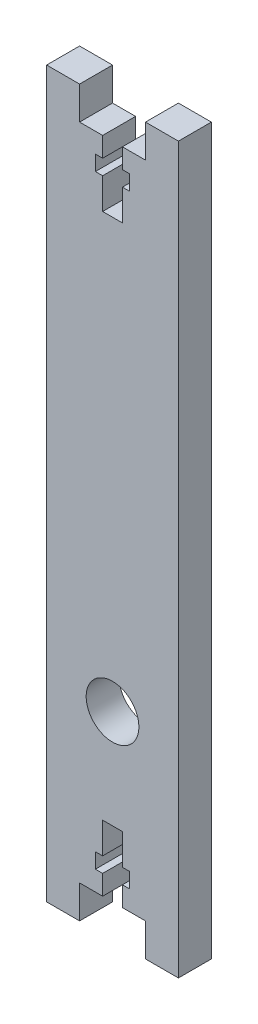
ISO-10303-21;
HEADER;
FILE_DESCRIPTION(('STEP AP214'),'2;1');
FILE_NAME('part.step','',(''),(''),'','','');
FILE_SCHEMA(('AUTOMOTIVE_DESIGN { 1 0 10303 214 1 1 1 1 }'));
ENDSEC;
DATA;
#1=APPLICATION_CONTEXT('core data for automotive mechanical design processes');
#2=APPLICATION_PROTOCOL_DEFINITION('international standard','automotive_design',2000,#1);
#3=PRODUCT_CONTEXT('',#1,'mechanical');
#4=PRODUCT('Part','Part','',(#3));
#5=PRODUCT_RELATED_PRODUCT_CATEGORY('part','',(#4));
#6=PRODUCT_DEFINITION_FORMATION('','',#4);
#7=PRODUCT_DEFINITION_CONTEXT('part definition',#1,'design');
#8=PRODUCT_DEFINITION('design','',#6,#7);
#9=PRODUCT_DEFINITION_SHAPE('','',#8);
#10=(LENGTH_UNIT() NAMED_UNIT(*) SI_UNIT(.MILLI.,.METRE.));
#11=(NAMED_UNIT(*) PLANE_ANGLE_UNIT() SI_UNIT($,.RADIAN.));
#12=(NAMED_UNIT(*) SI_UNIT($,.STERADIAN.) SOLID_ANGLE_UNIT());
#13=UNCERTAINTY_MEASURE_WITH_UNIT(LENGTH_MEASURE(1.E-05),#10,'distance_accuracy_value','');
#14=(GEOMETRIC_REPRESENTATION_CONTEXT(3) GLOBAL_UNCERTAINTY_ASSIGNED_CONTEXT((#13)) GLOBAL_UNIT_ASSIGNED_CONTEXT((#10,
#11,#12)) REPRESENTATION_CONTEXT('',''));
#15=CARTESIAN_POINT('',(0.,0.,0.));
#16=DIRECTION('',(0.,0.,1.));
#17=DIRECTION('',(1.,0.,0.));
#18=AXIS2_PLACEMENT_3D('',#15,#16,#17);
#19=CARTESIAN_POINT('',(0.,0.,5.));
#20=DIRECTION('',(0.,0.,-1.));
#21=DIRECTION('',(-1.,0.,0.));
#22=AXIS2_PLACEMENT_3D('',#19,#20,#21);
#23=PLANE('',#22);
#24=DIRECTION('',(0.,-1.,0.));
#25=VECTOR('',#24,1.);
#26=CARTESIAN_POINT('',(-10.,85.,5.));
#27=LINE('',#26,#25);
#28=CARTESIAN_POINT('',(-10.,85.,5.));
#29=VERTEX_POINT('',#28);
#30=CARTESIAN_POINT('',(-9.99999999999999,-25.,5.));
#31=VERTEX_POINT('',#30);
#32=EDGE_CURVE('E176',#29,#31,#27,.T.);
#33=ORIENTED_EDGE('',*,*,#32,.T.);
#34=DIRECTION('',(1.,0.,0.));
#35=VECTOR('',#34,1.);
#36=CARTESIAN_POINT('',(-4.99999999999999,-25.,5.));
#37=LINE('',#36,#35);
#38=CARTESIAN_POINT('',(-4.99999999999999,-25.,5.));
#39=VERTEX_POINT('',#38);
#40=EDGE_CURVE('E558',#31,#39,#37,.T.);
#41=ORIENTED_EDGE('',*,*,#40,.T.);
#42=DIRECTION('',(0.,1.,0.));
#43=VECTOR('',#42,1.);
#44=CARTESIAN_POINT('',(-4.99999999999999,-25.,5.));
#45=LINE('',#44,#43);
#46=CARTESIAN_POINT('',(-5.,-20.,5.));
#47=VERTEX_POINT('',#46);
#48=EDGE_CURVE('E469',#39,#47,#45,.T.);
#49=ORIENTED_EDGE('',*,*,#48,.T.);
#50=DIRECTION('',(1.,0.,0.));
#51=VECTOR('',#50,1.);
#52=CARTESIAN_POINT('',(-1.49999999999999,-20.,5.));
#53=LINE('',#52,#51);
#54=CARTESIAN_POINT('',(-1.49999999999999,-20.,5.));
#55=VERTEX_POINT('',#54);
#56=EDGE_CURVE('E488',#47,#55,#53,.T.);
#57=ORIENTED_EDGE('',*,*,#56,.T.);
#58=DIRECTION('',(0.,1.,0.));
#59=VECTOR('',#58,1.);
#60=CARTESIAN_POINT('',(-1.49999999999999,-17.,5.));
#61=LINE('',#60,#59);
#62=CARTESIAN_POINT('',(-1.49999999999999,-17.,5.));
#63=VERTEX_POINT('',#62);
#64=EDGE_CURVE('E485',#55,#63,#61,.T.);
#65=ORIENTED_EDGE('',*,*,#64,.T.);
#66=DIRECTION('',(-1.,0.,0.));
#67=VECTOR('',#66,1.);
#68=CARTESIAN_POINT('',(-1.49999999999999,-17.,5.));
#69=LINE('',#68,#67);
#70=CARTESIAN_POINT('',(-2.59999999999999,-17.,5.));
#71=VERTEX_POINT('',#70);
#72=EDGE_CURVE('E487',#63,#71,#69,.T.);
#73=ORIENTED_EDGE('',*,*,#72,.T.);
#74=DIRECTION('',(0.,1.,0.));
#75=VECTOR('',#74,1.);
#76=CARTESIAN_POINT('',(-2.59999999999999,-17.,5.));
#77=LINE('',#76,#75);
#78=CARTESIAN_POINT('',(-2.6,-14.7,5.));
#79=VERTEX_POINT('',#78);
#80=EDGE_CURVE('E490',#71,#79,#77,.T.);
#81=ORIENTED_EDGE('',*,*,#80,.T.);
#82=DIRECTION('',(1.,0.,0.));
#83=VECTOR('',#82,1.);
#84=CARTESIAN_POINT('',(-2.6,-14.7,5.));
#85=LINE('',#84,#83);
#86=CARTESIAN_POINT('',(-1.49999999999999,-14.7,5.));
#87=VERTEX_POINT('',#86);
#88=EDGE_CURVE('E496',#79,#87,#85,.T.);
#89=ORIENTED_EDGE('',*,*,#88,.T.);
#90=DIRECTION('',(0.,1.,0.));
#91=VECTOR('',#90,1.);
#92=CARTESIAN_POINT('',(-1.49999999999999,-10.,5.));
#93=LINE('',#92,#91);
#94=CARTESIAN_POINT('',(-1.49999999999999,-10.,5.));
#95=VERTEX_POINT('',#94);
#96=EDGE_CURVE('E498',#87,#95,#93,.T.);
#97=ORIENTED_EDGE('',*,*,#96,.T.);
#98=DIRECTION('',(1.,0.,0.));
#99=VECTOR('',#98,1.);
#100=CARTESIAN_POINT('',(1.50000000000001,-10.,5.));
#101=LINE('',#100,#99);
#102=CARTESIAN_POINT('',(1.50000000000001,-10.,5.));
#103=VERTEX_POINT('',#102);
#104=EDGE_CURVE('E500',#95,#103,#101,.T.);
#105=ORIENTED_EDGE('',*,*,#104,.T.);
#106=DIRECTION('',(0.,-1.,0.));
#107=VECTOR('',#106,1.);
#108=CARTESIAN_POINT('',(1.50000000000001,-14.7,5.));
#109=LINE('',#108,#107);
#110=CARTESIAN_POINT('',(1.50000000000001,-14.7,5.));
#111=VERTEX_POINT('',#110);
#112=EDGE_CURVE('E502',#103,#111,#109,.T.);
#113=ORIENTED_EDGE('',*,*,#112,.T.);
#114=DIRECTION('',(1.,0.,0.));
#115=VECTOR('',#114,1.);
#116=CARTESIAN_POINT('',(1.50000000000001,-14.7,5.));
#117=LINE('',#116,#115);
#118=CARTESIAN_POINT('',(2.60000000000001,-14.7,5.));
#119=VERTEX_POINT('',#118);
#120=EDGE_CURVE('E504',#111,#119,#117,.T.);
#121=ORIENTED_EDGE('',*,*,#120,.T.);
#122=DIRECTION('',(0.,-1.,0.));
#123=VECTOR('',#122,1.);
#124=CARTESIAN_POINT('',(2.60000000000001,-14.7,5.));
#125=LINE('',#124,#123);
#126=CARTESIAN_POINT('',(2.60000000000001,-17.,5.));
#127=VERTEX_POINT('',#126);
#128=EDGE_CURVE('E506',#119,#127,#125,.T.);
#129=ORIENTED_EDGE('',*,*,#128,.T.);
#130=DIRECTION('',(-1.,0.,0.));
#131=VECTOR('',#130,1.);
#132=CARTESIAN_POINT('',(2.60000000000001,-17.,5.));
#133=LINE('',#132,#131);
#134=CARTESIAN_POINT('',(1.50000000000001,-17.,5.));
#135=VERTEX_POINT('',#134);
#136=EDGE_CURVE('E508',#127,#135,#133,.T.);
#137=ORIENTED_EDGE('',*,*,#136,.T.);
#138=DIRECTION('',(0.,-1.,0.));
#139=VECTOR('',#138,1.);
#140=CARTESIAN_POINT('',(1.50000000000001,-20.,5.));
#141=LINE('',#140,#139);
#142=CARTESIAN_POINT('',(1.50000000000001,-20.,5.));
#143=VERTEX_POINT('',#142);
#144=EDGE_CURVE('E510',#135,#143,#141,.T.);
#145=ORIENTED_EDGE('',*,*,#144,.T.);
#146=DIRECTION('',(1.,0.,0.));
#147=VECTOR('',#146,1.);
#148=CARTESIAN_POINT('',(1.50000000000001,-20.,5.));
#149=LINE('',#148,#147);
#150=CARTESIAN_POINT('',(5.00000000000001,-20.,5.));
#151=VERTEX_POINT('',#150);
#152=EDGE_CURVE('E512',#143,#151,#149,.T.);
#153=ORIENTED_EDGE('',*,*,#152,.T.);
#154=DIRECTION('',(0.,-1.,0.));
#155=VECTOR('',#154,1.);
#156=CARTESIAN_POINT('',(5.00000000000001,-20.,5.));
#157=LINE('',#156,#155);
#158=CARTESIAN_POINT('',(5.,-25.,5.));
#159=VERTEX_POINT('',#158);
#160=EDGE_CURVE('E514',#151,#159,#157,.T.);
#161=ORIENTED_EDGE('',*,*,#160,.T.);
#162=DIRECTION('',(1.,0.,0.));
#163=VECTOR('',#162,1.);
#164=CARTESIAN_POINT('',(5.,-25.,5.));
#165=LINE('',#164,#163);
#166=CARTESIAN_POINT('',(10.,-25.,5.));
#167=VERTEX_POINT('',#166);
#168=EDGE_CURVE('E516',#159,#167,#165,.T.);
#169=ORIENTED_EDGE('',*,*,#168,.T.);
#170=DIRECTION('',(0.,1.,0.));
#171=VECTOR('',#170,1.);
#172=CARTESIAN_POINT('',(10.,-25.,5.));
#173=LINE('',#172,#171);
#174=CARTESIAN_POINT('',(10.,85.,5.));
#175=VERTEX_POINT('',#174);
#176=EDGE_CURVE('E518',#167,#175,#173,.T.);
#177=ORIENTED_EDGE('',*,*,#176,.T.);
#178=DIRECTION('',(-1.,0.,0.));
#179=VECTOR('',#178,1.);
#180=CARTESIAN_POINT('',(5.,85.,5.));
#181=LINE('',#180,#179);
#182=CARTESIAN_POINT('',(5.,85.,5.));
#183=VERTEX_POINT('',#182);
#184=EDGE_CURVE('E520',#175,#183,#181,.T.);
#185=ORIENTED_EDGE('',*,*,#184,.T.);
#186=DIRECTION('',(0.,-1.,0.));
#187=VECTOR('',#186,1.);
#188=CARTESIAN_POINT('',(5.,80.,5.));
#189=LINE('',#188,#187);
#190=CARTESIAN_POINT('',(5.,80.,5.));
#191=VERTEX_POINT('',#190);
#192=EDGE_CURVE('E522',#183,#191,#189,.T.);
#193=ORIENTED_EDGE('',*,*,#192,.T.);
#194=DIRECTION('',(-1.,0.,0.));
#195=VECTOR('',#194,1.);
#196=CARTESIAN_POINT('',(1.5,80.,5.));
#197=LINE('',#196,#195);
#198=CARTESIAN_POINT('',(1.5,80.,5.));
#199=VERTEX_POINT('',#198);
#200=EDGE_CURVE('E524',#191,#199,#197,.T.);
#201=ORIENTED_EDGE('',*,*,#200,.T.);
#202=DIRECTION('',(0.,-1.,0.));
#203=VECTOR('',#202,1.);
#204=CARTESIAN_POINT('',(1.5,80.,5.));
#205=LINE('',#204,#203);
#206=CARTESIAN_POINT('',(1.5,77.,5.));
#207=VERTEX_POINT('',#206);
#208=EDGE_CURVE('E526',#199,#207,#205,.T.);
#209=ORIENTED_EDGE('',*,*,#208,.T.);
#210=DIRECTION('',(1.,0.,0.));
#211=VECTOR('',#210,1.);
#212=CARTESIAN_POINT('',(2.6,77.,5.));
#213=LINE('',#212,#211);
#214=CARTESIAN_POINT('',(2.6,77.,5.));
#215=VERTEX_POINT('',#214);
#216=EDGE_CURVE('E528',#207,#215,#213,.T.);
#217=ORIENTED_EDGE('',*,*,#216,.T.);
#218=DIRECTION('',(0.,-1.,0.));
#219=VECTOR('',#218,1.);
#220=CARTESIAN_POINT('',(2.6,74.7,5.));
#221=LINE('',#220,#219);
#222=CARTESIAN_POINT('',(2.6,74.7,5.));
#223=VERTEX_POINT('',#222);
#224=EDGE_CURVE('E530',#215,#223,#221,.T.);
#225=ORIENTED_EDGE('',*,*,#224,.T.);
#226=DIRECTION('',(-1.,0.,0.));
#227=VECTOR('',#226,1.);
#228=CARTESIAN_POINT('',(1.5,74.7,5.));
#229=LINE('',#228,#227);
#230=CARTESIAN_POINT('',(1.5,74.7,5.));
#231=VERTEX_POINT('',#230);
#232=EDGE_CURVE('E532',#223,#231,#229,.T.);
#233=ORIENTED_EDGE('',*,*,#232,.T.);
#234=DIRECTION('',(0.,-1.,0.));
#235=VECTOR('',#234,1.);
#236=CARTESIAN_POINT('',(1.5,74.7,5.));
#237=LINE('',#236,#235);
#238=CARTESIAN_POINT('',(1.5,70.,5.));
#239=VERTEX_POINT('',#238);
#240=EDGE_CURVE('E534',#231,#239,#237,.T.);
#241=ORIENTED_EDGE('',*,*,#240,.T.);
#242=DIRECTION('',(-1.,0.,0.));
#243=VECTOR('',#242,1.);
#244=CARTESIAN_POINT('',(1.5,70.,5.));
#245=LINE('',#244,#243);
#246=CARTESIAN_POINT('',(-1.5,70.,5.));
#247=VERTEX_POINT('',#246);
#248=EDGE_CURVE('E536',#239,#247,#245,.T.);
#249=ORIENTED_EDGE('',*,*,#248,.T.);
#250=DIRECTION('',(0.,1.,0.));
#251=VECTOR('',#250,1.);
#252=CARTESIAN_POINT('',(-1.5,70.,5.));
#253=LINE('',#252,#251);
#254=CARTESIAN_POINT('',(-1.5,74.7,5.));
#255=VERTEX_POINT('',#254);
#256=EDGE_CURVE('E538',#247,#255,#253,.T.);
#257=ORIENTED_EDGE('',*,*,#256,.T.);
#258=DIRECTION('',(-1.,0.,0.));
#259=VECTOR('',#258,1.);
#260=CARTESIAN_POINT('',(-2.6,74.7,5.));
#261=LINE('',#260,#259);
#262=CARTESIAN_POINT('',(-2.6,74.7,5.));
#263=VERTEX_POINT('',#262);
#264=EDGE_CURVE('E540',#255,#263,#261,.T.);
#265=ORIENTED_EDGE('',*,*,#264,.T.);
#266=DIRECTION('',(0.,1.,0.));
#267=VECTOR('',#266,1.);
#268=CARTESIAN_POINT('',(-2.6,77.,5.));
#269=LINE('',#268,#267);
#270=CARTESIAN_POINT('',(-2.6,77.,5.));
#271=VERTEX_POINT('',#270);
#272=EDGE_CURVE('E542',#263,#271,#269,.T.);
#273=ORIENTED_EDGE('',*,*,#272,.T.);
#274=DIRECTION('',(1.,0.,0.));
#275=VECTOR('',#274,1.);
#276=CARTESIAN_POINT('',(-1.5,77.,5.));
#277=LINE('',#276,#275);
#278=CARTESIAN_POINT('',(-1.5,77.,5.));
#279=VERTEX_POINT('',#278);
#280=EDGE_CURVE('E544',#271,#279,#277,.T.);
#281=ORIENTED_EDGE('',*,*,#280,.T.);
#282=DIRECTION('',(0.,1.,0.));
#283=VECTOR('',#282,1.);
#284=CARTESIAN_POINT('',(-1.5,77.,5.));
#285=LINE('',#284,#283);
#286=CARTESIAN_POINT('',(-1.5,80.,5.));
#287=VERTEX_POINT('',#286);
#288=EDGE_CURVE('E280',#279,#287,#285,.T.);
#289=ORIENTED_EDGE('',*,*,#288,.T.);
#290=DIRECTION('',(-1.,0.,0.));
#291=VECTOR('',#290,1.);
#292=CARTESIAN_POINT('',(-1.5,80.,5.));
#293=LINE('',#292,#291);
#294=CARTESIAN_POINT('',(-5.,80.,5.));
#295=VERTEX_POINT('',#294);
#296=EDGE_CURVE('E274',#287,#295,#293,.T.);
#297=ORIENTED_EDGE('',*,*,#296,.T.);
#298=DIRECTION('',(0.,1.,0.));
#299=VECTOR('',#298,1.);
#300=CARTESIAN_POINT('',(-5.,85.,5.));
#301=LINE('',#300,#299);
#302=CARTESIAN_POINT('',(-5.,85.,5.));
#303=VERTEX_POINT('',#302);
#304=EDGE_CURVE('E278',#295,#303,#301,.T.);
#305=ORIENTED_EDGE('',*,*,#304,.T.);
#306=DIRECTION('',(-1.,0.,0.));
#307=VECTOR('',#306,1.);
#308=CARTESIAN_POINT('',(-5.,85.,5.));
#309=LINE('',#308,#307);
#310=EDGE_CURVE('E50',#303,#29,#309,.T.);
#311=ORIENTED_EDGE('',*,*,#310,.T.);
#312=EDGE_LOOP('',(#33,#41,#49,#57,#65,#73,#81,#89,#97,#105,#113,#121,#129,#137,#145,#153,#161,
#169,#177,#185,#193,#201,#209,#217,#225,#233,#241,#249,#257,#265,#273,#281,#289,#297,#305,#311));
#313=FACE_BOUND('',#312,.T.);
#314=CARTESIAN_POINT('',(0.,4.99999999999999,5.));
#315=DIRECTION('',(0.,0.,1.));
#316=DIRECTION('',(1.,0.,0.));
#317=AXIS2_PLACEMENT_3D('',#314,#315,#316);
#318=CIRCLE('',#317,4.);
#319=CARTESIAN_POINT('',(4.,4.99999999999999,5.));
#320=VERTEX_POINT('',#319);
#321=EDGE_CURVE('E300',#320,#320,#318,.T.);
#322=ORIENTED_EDGE('',*,*,#321,.F.);
#323=EDGE_LOOP('',(#322));
#324=FACE_BOUND('',#323,.T.);
#325=ADVANCED_FACE('F33',(#313,#324),#23,.F.);
#326=CARTESIAN_POINT('',(0.,0.,0.));
#327=DIRECTION('',(0.,0.,-1.));
#328=DIRECTION('',(-1.,0.,0.));
#329=AXIS2_PLACEMENT_3D('',#326,#327,#328);
#330=PLANE('',#329);
#331=DIRECTION('',(0.,-1.,0.));
#332=VECTOR('',#331,1.);
#333=CARTESIAN_POINT('',(-9.99999999999999,-25.,0.));
#334=LINE('',#333,#332);
#335=CARTESIAN_POINT('',(-10.,85.,0.));
#336=VERTEX_POINT('',#335);
#337=CARTESIAN_POINT('',(-9.99999999999999,-25.,0.));
#338=VERTEX_POINT('',#337);
#339=EDGE_CURVE('E170',#336,#338,#334,.T.);
#340=ORIENTED_EDGE('',*,*,#339,.F.);
#341=DIRECTION('',(-1.,0.,0.));
#342=VECTOR('',#341,1.);
#343=CARTESIAN_POINT('',(-5.,85.,0.));
#344=LINE('',#343,#342);
#345=CARTESIAN_POINT('',(-5.,85.,0.));
#346=VERTEX_POINT('',#345);
#347=EDGE_CURVE('E367',#346,#336,#344,.T.);
#348=ORIENTED_EDGE('',*,*,#347,.F.);
#349=DIRECTION('',(0.,1.,0.));
#350=VECTOR('',#349,1.);
#351=CARTESIAN_POINT('',(-5.,85.,0.));
#352=LINE('',#351,#350);
#353=CARTESIAN_POINT('',(-5.,80.,0.));
#354=VERTEX_POINT('',#353);
#355=EDGE_CURVE('E163',#354,#346,#352,.T.);
#356=ORIENTED_EDGE('',*,*,#355,.F.);
#357=DIRECTION('',(-1.,0.,0.));
#358=VECTOR('',#357,1.);
#359=CARTESIAN_POINT('',(-1.5,80.,0.));
#360=LINE('',#359,#358);
#361=CARTESIAN_POINT('',(-1.5,80.,0.));
#362=VERTEX_POINT('',#361);
#363=EDGE_CURVE('E288',#362,#354,#360,.T.);
#364=ORIENTED_EDGE('',*,*,#363,.F.);
#365=DIRECTION('',(0.,1.,0.));
#366=VECTOR('',#365,1.);
#367=CARTESIAN_POINT('',(-1.5,77.,0.));
#368=LINE('',#367,#366);
#369=CARTESIAN_POINT('',(-1.5,77.,0.));
#370=VERTEX_POINT('',#369);
#371=EDGE_CURVE('E363',#370,#362,#368,.T.);
#372=ORIENTED_EDGE('',*,*,#371,.F.);
#373=DIRECTION('',(1.,0.,0.));
#374=VECTOR('',#373,1.);
#375=CARTESIAN_POINT('',(-1.5,77.,0.));
#376=LINE('',#375,#374);
#377=CARTESIAN_POINT('',(-2.6,77.,0.));
#378=VERTEX_POINT('',#377);
#379=EDGE_CURVE('E361',#378,#370,#376,.T.);
#380=ORIENTED_EDGE('',*,*,#379,.F.);
#381=DIRECTION('',(0.,1.,0.));
#382=VECTOR('',#381,1.);
#383=CARTESIAN_POINT('',(-2.6,77.,0.));
#384=LINE('',#383,#382);
#385=CARTESIAN_POINT('',(-2.6,74.7,0.));
#386=VERTEX_POINT('',#385);
#387=EDGE_CURVE('E359',#386,#378,#384,.T.);
#388=ORIENTED_EDGE('',*,*,#387,.F.);
#389=DIRECTION('',(-1.,0.,0.));
#390=VECTOR('',#389,1.);
#391=CARTESIAN_POINT('',(-2.6,74.7,0.));
#392=LINE('',#391,#390);
#393=CARTESIAN_POINT('',(-1.5,74.7,0.));
#394=VERTEX_POINT('',#393);
#395=EDGE_CURVE('E357',#394,#386,#392,.T.);
#396=ORIENTED_EDGE('',*,*,#395,.F.);
#397=DIRECTION('',(0.,1.,0.));
#398=VECTOR('',#397,1.);
#399=CARTESIAN_POINT('',(-1.5,70.,0.));
#400=LINE('',#399,#398);
#401=CARTESIAN_POINT('',(-1.5,70.,0.));
#402=VERTEX_POINT('',#401);
#403=EDGE_CURVE('E355',#402,#394,#400,.T.);
#404=ORIENTED_EDGE('',*,*,#403,.F.);
#405=DIRECTION('',(-1.,0.,0.));
#406=VECTOR('',#405,1.);
#407=CARTESIAN_POINT('',(1.5,70.,0.));
#408=LINE('',#407,#406);
#409=CARTESIAN_POINT('',(1.5,70.,0.));
#410=VERTEX_POINT('',#409);
#411=EDGE_CURVE('E353',#410,#402,#408,.T.);
#412=ORIENTED_EDGE('',*,*,#411,.F.);
#413=DIRECTION('',(0.,-1.,0.));
#414=VECTOR('',#413,1.);
#415=CARTESIAN_POINT('',(1.5,74.7,0.));
#416=LINE('',#415,#414);
#417=CARTESIAN_POINT('',(1.5,74.7,0.));
#418=VERTEX_POINT('',#417);
#419=EDGE_CURVE('E351',#418,#410,#416,.T.);
#420=ORIENTED_EDGE('',*,*,#419,.F.);
#421=DIRECTION('',(-1.,0.,0.));
#422=VECTOR('',#421,1.);
#423=CARTESIAN_POINT('',(1.5,74.7,0.));
#424=LINE('',#423,#422);
#425=CARTESIAN_POINT('',(2.6,74.7,0.));
#426=VERTEX_POINT('',#425);
#427=EDGE_CURVE('E349',#426,#418,#424,.T.);
#428=ORIENTED_EDGE('',*,*,#427,.F.);
#429=DIRECTION('',(0.,-1.,0.));
#430=VECTOR('',#429,1.);
#431=CARTESIAN_POINT('',(2.6,74.7,0.));
#432=LINE('',#431,#430);
#433=CARTESIAN_POINT('',(2.6,77.,0.));
#434=VERTEX_POINT('',#433);
#435=EDGE_CURVE('E347',#434,#426,#432,.T.);
#436=ORIENTED_EDGE('',*,*,#435,.F.);
#437=DIRECTION('',(1.,0.,0.));
#438=VECTOR('',#437,1.);
#439=CARTESIAN_POINT('',(2.6,77.,0.));
#440=LINE('',#439,#438);
#441=CARTESIAN_POINT('',(1.5,77.,0.));
#442=VERTEX_POINT('',#441);
#443=EDGE_CURVE('E345',#442,#434,#440,.T.);
#444=ORIENTED_EDGE('',*,*,#443,.F.);
#445=DIRECTION('',(0.,-1.,0.));
#446=VECTOR('',#445,1.);
#447=CARTESIAN_POINT('',(1.5,80.,0.));
#448=LINE('',#447,#446);
#449=CARTESIAN_POINT('',(1.5,80.,0.));
#450=VERTEX_POINT('',#449);
#451=EDGE_CURVE('E343',#450,#442,#448,.T.);
#452=ORIENTED_EDGE('',*,*,#451,.F.);
#453=DIRECTION('',(-1.,0.,0.));
#454=VECTOR('',#453,1.);
#455=CARTESIAN_POINT('',(1.5,80.,0.));
#456=LINE('',#455,#454);
#457=CARTESIAN_POINT('',(5.,80.,0.));
#458=VERTEX_POINT('',#457);
#459=EDGE_CURVE('E341',#458,#450,#456,.T.);
#460=ORIENTED_EDGE('',*,*,#459,.F.);
#461=DIRECTION('',(0.,-1.,0.));
#462=VECTOR('',#461,1.);
#463=CARTESIAN_POINT('',(5.,80.,0.));
#464=LINE('',#463,#462);
#465=CARTESIAN_POINT('',(5.,85.,0.));
#466=VERTEX_POINT('',#465);
#467=EDGE_CURVE('E339',#466,#458,#464,.T.);
#468=ORIENTED_EDGE('',*,*,#467,.F.);
#469=DIRECTION('',(-1.,0.,0.));
#470=VECTOR('',#469,1.);
#471=CARTESIAN_POINT('',(5.,85.,0.));
#472=LINE('',#471,#470);
#473=CARTESIAN_POINT('',(10.,85.,0.));
#474=VERTEX_POINT('',#473);
#475=EDGE_CURVE('E337',#474,#466,#472,.T.);
#476=ORIENTED_EDGE('',*,*,#475,.F.);
#477=DIRECTION('',(0.,1.,0.));
#478=VECTOR('',#477,1.);
#479=CARTESIAN_POINT('',(10.,85.,0.));
#480=LINE('',#479,#478);
#481=CARTESIAN_POINT('',(10.,-25.,0.));
#482=VERTEX_POINT('',#481);
#483=EDGE_CURVE('E335',#482,#474,#480,.T.);
#484=ORIENTED_EDGE('',*,*,#483,.F.);
#485=DIRECTION('',(1.,0.,0.));
#486=VECTOR('',#485,1.);
#487=CARTESIAN_POINT('',(5.,-25.,0.));
#488=LINE('',#487,#486);
#489=CARTESIAN_POINT('',(5.,-25.,0.));
#490=VERTEX_POINT('',#489);
#491=EDGE_CURVE('E332',#490,#482,#488,.T.);
#492=ORIENTED_EDGE('',*,*,#491,.F.);
#493=DIRECTION('',(0.,-1.,0.));
#494=VECTOR('',#493,1.);
#495=CARTESIAN_POINT('',(5.00000000000001,-20.,0.));
#496=LINE('',#495,#494);
#497=CARTESIAN_POINT('',(5.00000000000001,-20.,0.));
#498=VERTEX_POINT('',#497);
#499=EDGE_CURVE('E330',#498,#490,#496,.T.);
#500=ORIENTED_EDGE('',*,*,#499,.F.);
#501=DIRECTION('',(1.,0.,0.));
#502=VECTOR('',#501,1.);
#503=CARTESIAN_POINT('',(1.50000000000001,-20.,0.));
#504=LINE('',#503,#502);
#505=CARTESIAN_POINT('',(1.50000000000001,-20.,0.));
#506=VERTEX_POINT('',#505);
#507=EDGE_CURVE('E328',#506,#498,#504,.T.);
#508=ORIENTED_EDGE('',*,*,#507,.F.);
#509=DIRECTION('',(0.,-1.,0.));
#510=VECTOR('',#509,1.);
#511=CARTESIAN_POINT('',(1.50000000000001,-20.,0.));
#512=LINE('',#511,#510);
#513=CARTESIAN_POINT('',(1.50000000000001,-17.,0.));
#514=VERTEX_POINT('',#513);
#515=EDGE_CURVE('E326',#514,#506,#512,.T.);
#516=ORIENTED_EDGE('',*,*,#515,.F.);
#517=DIRECTION('',(-1.,0.,0.));
#518=VECTOR('',#517,1.);
#519=CARTESIAN_POINT('',(2.60000000000001,-17.,0.));
#520=LINE('',#519,#518);
#521=CARTESIAN_POINT('',(2.60000000000001,-17.,0.));
#522=VERTEX_POINT('',#521);
#523=EDGE_CURVE('E324',#522,#514,#520,.T.);
#524=ORIENTED_EDGE('',*,*,#523,.F.);
#525=DIRECTION('',(0.,-1.,0.));
#526=VECTOR('',#525,1.);
#527=CARTESIAN_POINT('',(2.60000000000001,-14.7,0.));
#528=LINE('',#527,#526);
#529=CARTESIAN_POINT('',(2.60000000000001,-14.7,0.));
#530=VERTEX_POINT('',#529);
#531=EDGE_CURVE('E322',#530,#522,#528,.T.);
#532=ORIENTED_EDGE('',*,*,#531,.F.);
#533=DIRECTION('',(1.,0.,0.));
#534=VECTOR('',#533,1.);
#535=CARTESIAN_POINT('',(1.50000000000001,-14.7,0.));
#536=LINE('',#535,#534);
#537=CARTESIAN_POINT('',(1.50000000000001,-14.7,0.));
#538=VERTEX_POINT('',#537);
#539=EDGE_CURVE('E320',#538,#530,#536,.T.);
#540=ORIENTED_EDGE('',*,*,#539,.F.);
#541=DIRECTION('',(0.,-1.,0.));
#542=VECTOR('',#541,1.);
#543=CARTESIAN_POINT('',(1.50000000000001,-14.7,0.));
#544=LINE('',#543,#542);
#545=CARTESIAN_POINT('',(1.50000000000001,-10.,0.));
#546=VERTEX_POINT('',#545);
#547=EDGE_CURVE('E318',#546,#538,#544,.T.);
#548=ORIENTED_EDGE('',*,*,#547,.F.);
#549=DIRECTION('',(1.,0.,0.));
#550=VECTOR('',#549,1.);
#551=CARTESIAN_POINT('',(1.50000000000001,-10.,0.));
#552=LINE('',#551,#550);
#553=CARTESIAN_POINT('',(-1.49999999999999,-10.,0.));
#554=VERTEX_POINT('',#553);
#555=EDGE_CURVE('E316',#554,#546,#552,.T.);
#556=ORIENTED_EDGE('',*,*,#555,.F.);
#557=DIRECTION('',(0.,1.,0.));
#558=VECTOR('',#557,1.);
#559=CARTESIAN_POINT('',(-1.49999999999999,-10.,0.));
#560=LINE('',#559,#558);
#561=CARTESIAN_POINT('',(-1.49999999999999,-14.7,0.));
#562=VERTEX_POINT('',#561);
#563=EDGE_CURVE('E314',#562,#554,#560,.T.);
#564=ORIENTED_EDGE('',*,*,#563,.F.);
#565=DIRECTION('',(1.,0.,0.));
#566=VECTOR('',#565,1.);
#567=CARTESIAN_POINT('',(-2.6,-14.7,0.));
#568=LINE('',#567,#566);
#569=CARTESIAN_POINT('',(-2.6,-14.7,0.));
#570=VERTEX_POINT('',#569);
#571=EDGE_CURVE('E312',#570,#562,#568,.T.);
#572=ORIENTED_EDGE('',*,*,#571,.F.);
#573=DIRECTION('',(0.,1.,0.));
#574=VECTOR('',#573,1.);
#575=CARTESIAN_POINT('',(-2.59999999999999,-17.,0.));
#576=LINE('',#575,#574);
#577=CARTESIAN_POINT('',(-2.59999999999999,-17.,0.));
#578=VERTEX_POINT('',#577);
#579=EDGE_CURVE('E310',#578,#570,#576,.T.);
#580=ORIENTED_EDGE('',*,*,#579,.F.);
#581=DIRECTION('',(-1.,0.,0.));
#582=VECTOR('',#581,1.);
#583=CARTESIAN_POINT('',(-1.49999999999999,-17.,0.));
#584=LINE('',#583,#582);
#585=CARTESIAN_POINT('',(-1.49999999999999,-17.,0.));
#586=VERTEX_POINT('',#585);
#587=EDGE_CURVE('E308',#586,#578,#584,.T.);
#588=ORIENTED_EDGE('',*,*,#587,.F.);
#589=DIRECTION('',(0.,1.,0.));
#590=VECTOR('',#589,1.);
#591=CARTESIAN_POINT('',(-1.49999999999999,-17.,0.));
#592=LINE('',#591,#590);
#593=CARTESIAN_POINT('',(-1.49999999999999,-20.,0.));
#594=VERTEX_POINT('',#593);
#595=EDGE_CURVE('E306',#594,#586,#592,.T.);
#596=ORIENTED_EDGE('',*,*,#595,.F.);
#597=DIRECTION('',(1.,0.,0.));
#598=VECTOR('',#597,1.);
#599=CARTESIAN_POINT('',(-1.49999999999999,-20.,0.));
#600=LINE('',#599,#598);
#601=CARTESIAN_POINT('',(-5.,-20.,0.));
#602=VERTEX_POINT('',#601);
#603=EDGE_CURVE('E304',#602,#594,#600,.T.);
#604=ORIENTED_EDGE('',*,*,#603,.F.);
#605=DIRECTION('',(0.,1.,0.));
#606=VECTOR('',#605,1.);
#607=CARTESIAN_POINT('',(-4.99999999999999,-25.,0.));
#608=LINE('',#607,#606);
#609=CARTESIAN_POINT('',(-4.99999999999999,-25.,0.));
#610=VERTEX_POINT('',#609);
#611=EDGE_CURVE('E302',#610,#602,#608,.T.);
#612=ORIENTED_EDGE('',*,*,#611,.F.);
#613=DIRECTION('',(1.,0.,0.));
#614=VECTOR('',#613,1.);
#615=CARTESIAN_POINT('',(-4.99999999999999,-25.,0.));
#616=LINE('',#615,#614);
#617=EDGE_CURVE('E299',#338,#610,#616,.T.);
#618=ORIENTED_EDGE('',*,*,#617,.F.);
#619=EDGE_LOOP('',(#340,#348,#356,#364,#372,#380,#388,#396,#404,#412,#420,#428,#436,#444,#452,
#460,#468,#476,#484,#492,#500,#508,#516,#524,#532,#540,#548,#556,#564,#572,#580,#588,#596,#604,
#612,#618));
#620=FACE_BOUND('',#619,.T.);
#621=CARTESIAN_POINT('',(0.,4.99999999999999,0.));
#622=DIRECTION('',(0.,0.,1.));
#623=DIRECTION('',(1.,0.,0.));
#624=AXIS2_PLACEMENT_3D('',#621,#622,#623);
#625=CIRCLE('',#624,4.);
#626=CARTESIAN_POINT('',(4.,4.99999999999999,0.));
#627=VERTEX_POINT('',#626);
#628=EDGE_CURVE('E562',#627,#627,#625,.T.);
#629=ORIENTED_EDGE('',*,*,#628,.T.);
#630=EDGE_LOOP('',(#629));
#631=FACE_BOUND('',#630,.T.);
#632=ADVANCED_FACE('F473',(#620,#631),#330,.T.);
#633=CARTESIAN_POINT('',(-9.99999999999999,-25.,5.));
#634=DIRECTION('',(1.,0.,0.));
#635=DIRECTION('',(0.,1.,0.));
#636=AXIS2_PLACEMENT_3D('',#633,#634,#635);
#637=PLANE('',#636);
#638=ORIENTED_EDGE('',*,*,#339,.T.);
#639=DIRECTION('',(0.,0.,-1.));
#640=VECTOR('',#639,1.);
#641=CARTESIAN_POINT('',(-9.99999999999999,-25.,5.));
#642=LINE('',#641,#640);
#643=EDGE_CURVE('E11',#31,#338,#642,.T.);
#644=ORIENTED_EDGE('',*,*,#643,.F.);
#645=ORIENTED_EDGE('',*,*,#32,.F.);
#646=DIRECTION('',(0.,0.,-1.));
#647=VECTOR('',#646,1.);
#648=CARTESIAN_POINT('',(-10.,85.,5.));
#649=LINE('',#648,#647);
#650=EDGE_CURVE('E294',#29,#336,#649,.T.);
#651=ORIENTED_EDGE('',*,*,#650,.T.);
#652=EDGE_LOOP('',(#638,#644,#645,#651));
#653=FACE_BOUND('',#652,.T.);
#654=ADVANCED_FACE('F35',(#653),#637,.F.);
#655=CARTESIAN_POINT('',(-4.99999999999999,-25.,5.));
#656=DIRECTION('',(0.,1.,0.));
#657=DIRECTION('',(-1.,0.,0.));
#658=AXIS2_PLACEMENT_3D('',#655,#656,#657);
#659=PLANE('',#658);
#660=ORIENTED_EDGE('',*,*,#617,.T.);
#661=DIRECTION('',(0.,0.,-1.));
#662=VECTOR('',#661,1.);
#663=CARTESIAN_POINT('',(-4.99999999999999,-25.,5.));
#664=LINE('',#663,#662);
#665=EDGE_CURVE('E42',#39,#610,#664,.T.);
#666=ORIENTED_EDGE('',*,*,#665,.F.);
#667=ORIENTED_EDGE('',*,*,#40,.F.);
#668=ORIENTED_EDGE('',*,*,#643,.T.);
#669=EDGE_LOOP('',(#660,#666,#667,#668));
#670=FACE_BOUND('',#669,.T.);
#671=ADVANCED_FACE('F564',(#670),#659,.F.);
#672=CARTESIAN_POINT('',(-4.99999999999999,-25.,5.));
#673=DIRECTION('',(-1.,0.,0.));
#674=DIRECTION('',(0.,-1.,0.));
#675=AXIS2_PLACEMENT_3D('',#672,#673,#674);
#676=PLANE('',#675);
#677=ORIENTED_EDGE('',*,*,#611,.T.);
#678=DIRECTION('',(0.,0.,-1.));
#679=VECTOR('',#678,1.);
#680=CARTESIAN_POINT('',(-5.,-20.,5.));
#681=LINE('',#680,#679);
#682=EDGE_CURVE('E460',#47,#602,#681,.T.);
#683=ORIENTED_EDGE('',*,*,#682,.F.);
#684=ORIENTED_EDGE('',*,*,#48,.F.);
#685=ORIENTED_EDGE('',*,*,#665,.T.);
#686=EDGE_LOOP('',(#677,#683,#684,#685));
#687=FACE_BOUND('',#686,.T.);
#688=ADVANCED_FACE('F467',(#687),#676,.F.);
#689=CARTESIAN_POINT('',(-1.49999999999999,-20.,5.));
#690=DIRECTION('',(0.,1.,0.));
#691=DIRECTION('',(0.,0.,1.));
#692=AXIS2_PLACEMENT_3D('',#689,#690,#691);
#693=PLANE('',#692);
#694=ORIENTED_EDGE('',*,*,#603,.T.);
#695=DIRECTION('',(0.,0.,-1.));
#696=VECTOR('',#695,1.);
#697=CARTESIAN_POINT('',(-1.49999999999999,-20.,5.));
#698=LINE('',#697,#696);
#699=EDGE_CURVE('E457',#55,#594,#698,.T.);
#700=ORIENTED_EDGE('',*,*,#699,.F.);
#701=ORIENTED_EDGE('',*,*,#56,.F.);
#702=ORIENTED_EDGE('',*,*,#682,.T.);
#703=EDGE_LOOP('',(#694,#700,#701,#702));
#704=FACE_BOUND('',#703,.T.);
#705=ADVANCED_FACE('F479',(#704),#693,.F.);
#706=CARTESIAN_POINT('',(-1.49999999999999,-17.,5.));
#707=DIRECTION('',(-1.,0.,0.));
#708=DIRECTION('',(0.,-1.,0.));
#709=AXIS2_PLACEMENT_3D('',#706,#707,#708);
#710=PLANE('',#709);
#711=ORIENTED_EDGE('',*,*,#595,.T.);
#712=DIRECTION('',(0.,0.,-1.));
#713=VECTOR('',#712,1.);
#714=CARTESIAN_POINT('',(-1.49999999999999,-17.,5.));
#715=LINE('',#714,#713);
#716=EDGE_CURVE('E454',#63,#586,#715,.T.);
#717=ORIENTED_EDGE('',*,*,#716,.F.);
#718=ORIENTED_EDGE('',*,*,#64,.F.);
#719=ORIENTED_EDGE('',*,*,#699,.T.);
#720=EDGE_LOOP('',(#711,#717,#718,#719));
#721=FACE_BOUND('',#720,.T.);
#722=ADVANCED_FACE('F483',(#721),#710,.F.);
#723=CARTESIAN_POINT('',(-1.49999999999999,-17.,5.));
#724=DIRECTION('',(0.,-1.,0.));
#725=DIRECTION('',(0.,0.,-1.));
#726=AXIS2_PLACEMENT_3D('',#723,#724,#725);
#727=PLANE('',#726);
#728=ORIENTED_EDGE('',*,*,#587,.T.);
#729=DIRECTION('',(0.,0.,-1.));
#730=VECTOR('',#729,1.);
#731=CARTESIAN_POINT('',(-2.59999999999999,-17.,5.));
#732=LINE('',#731,#730);
#733=EDGE_CURVE('E451',#71,#578,#732,.T.);
#734=ORIENTED_EDGE('',*,*,#733,.F.);
#735=ORIENTED_EDGE('',*,*,#72,.F.);
#736=ORIENTED_EDGE('',*,*,#716,.T.);
#737=EDGE_LOOP('',(#728,#734,#735,#736));
#738=FACE_BOUND('',#737,.T.);
#739=ADVANCED_FACE('F689',(#738),#727,.F.);
#740=CARTESIAN_POINT('',(-2.59999999999999,-17.,5.));
#741=DIRECTION('',(-1.,0.,0.));
#742=DIRECTION('',(0.,-1.,0.));
#743=AXIS2_PLACEMENT_3D('',#740,#741,#742);
#744=PLANE('',#743);
#745=ORIENTED_EDGE('',*,*,#579,.T.);
#746=DIRECTION('',(0.,0.,-1.));
#747=VECTOR('',#746,1.);
#748=CARTESIAN_POINT('',(-2.6,-14.7,5.));
#749=LINE('',#748,#747);
#750=EDGE_CURVE('E448',#79,#570,#749,.T.);
#751=ORIENTED_EDGE('',*,*,#750,.F.);
#752=ORIENTED_EDGE('',*,*,#80,.F.);
#753=ORIENTED_EDGE('',*,*,#733,.T.);
#754=EDGE_LOOP('',(#745,#751,#752,#753));
#755=FACE_BOUND('',#754,.T.);
#756=ADVANCED_FACE('F685',(#755),#744,.F.);
#757=CARTESIAN_POINT('',(-2.6,-14.7,5.));
#758=DIRECTION('',(0.,1.,0.));
#759=DIRECTION('',(0.,0.,1.));
#760=AXIS2_PLACEMENT_3D('',#757,#758,#759);
#761=PLANE('',#760);
#762=ORIENTED_EDGE('',*,*,#571,.T.);
#763=DIRECTION('',(0.,0.,-1.));
#764=VECTOR('',#763,1.);
#765=CARTESIAN_POINT('',(-1.49999999999999,-14.7,5.));
#766=LINE('',#765,#764);
#767=EDGE_CURVE('E445',#87,#562,#766,.T.);
#768=ORIENTED_EDGE('',*,*,#767,.F.);
#769=ORIENTED_EDGE('',*,*,#88,.F.);
#770=ORIENTED_EDGE('',*,*,#750,.T.);
#771=EDGE_LOOP('',(#762,#768,#769,#770));
#772=FACE_BOUND('',#771,.T.);
#773=ADVANCED_FACE('F681',(#772),#761,.F.);
#774=CARTESIAN_POINT('',(-1.49999999999999,-10.,5.));
#775=DIRECTION('',(-1.,0.,0.));
#776=DIRECTION('',(0.,-1.,0.));
#777=AXIS2_PLACEMENT_3D('',#774,#775,#776);
#778=PLANE('',#777);
#779=ORIENTED_EDGE('',*,*,#563,.T.);
#780=DIRECTION('',(0.,0.,-1.));
#781=VECTOR('',#780,1.);
#782=CARTESIAN_POINT('',(-1.49999999999999,-10.,5.));
#783=LINE('',#782,#781);
#784=EDGE_CURVE('E442',#95,#554,#783,.T.);
#785=ORIENTED_EDGE('',*,*,#784,.F.);
#786=ORIENTED_EDGE('',*,*,#96,.F.);
#787=ORIENTED_EDGE('',*,*,#767,.T.);
#788=EDGE_LOOP('',(#779,#785,#786,#787));
#789=FACE_BOUND('',#788,.T.);
#790=ADVANCED_FACE('F677',(#789),#778,.F.);
#791=CARTESIAN_POINT('',(1.50000000000001,-10.,5.));
#792=DIRECTION('',(0.,1.,0.));
#793=DIRECTION('',(0.,0.,1.));
#794=AXIS2_PLACEMENT_3D('',#791,#792,#793);
#795=PLANE('',#794);
#796=ORIENTED_EDGE('',*,*,#555,.T.);
#797=DIRECTION('',(0.,0.,-1.));
#798=VECTOR('',#797,1.);
#799=CARTESIAN_POINT('',(1.50000000000001,-10.,5.));
#800=LINE('',#799,#798);
#801=EDGE_CURVE('E439',#103,#546,#800,.T.);
#802=ORIENTED_EDGE('',*,*,#801,.F.);
#803=ORIENTED_EDGE('',*,*,#104,.F.);
#804=ORIENTED_EDGE('',*,*,#784,.T.);
#805=EDGE_LOOP('',(#796,#802,#803,#804));
#806=FACE_BOUND('',#805,.T.);
#807=ADVANCED_FACE('F673',(#806),#795,.F.);
#808=CARTESIAN_POINT('',(1.50000000000001,-14.7,5.));
#809=DIRECTION('',(1.,0.,0.));
#810=DIRECTION('',(0.,1.,0.));
#811=AXIS2_PLACEMENT_3D('',#808,#809,#810);
#812=PLANE('',#811);
#813=ORIENTED_EDGE('',*,*,#547,.T.);
#814=DIRECTION('',(0.,0.,-1.));
#815=VECTOR('',#814,1.);
#816=CARTESIAN_POINT('',(1.50000000000001,-14.7,5.));
#817=LINE('',#816,#815);
#818=EDGE_CURVE('E436',#111,#538,#817,.T.);
#819=ORIENTED_EDGE('',*,*,#818,.F.);
#820=ORIENTED_EDGE('',*,*,#112,.F.);
#821=ORIENTED_EDGE('',*,*,#801,.T.);
#822=EDGE_LOOP('',(#813,#819,#820,#821));
#823=FACE_BOUND('',#822,.T.);
#824=ADVANCED_FACE('F669',(#823),#812,.F.);
#825=CARTESIAN_POINT('',(1.50000000000001,-14.7,5.));
#826=DIRECTION('',(0.,1.,0.));
#827=DIRECTION('',(0.,0.,1.));
#828=AXIS2_PLACEMENT_3D('',#825,#826,#827);
#829=PLANE('',#828);
#830=ORIENTED_EDGE('',*,*,#539,.T.);
#831=DIRECTION('',(0.,0.,-1.));
#832=VECTOR('',#831,1.);
#833=CARTESIAN_POINT('',(2.60000000000001,-14.7,5.));
#834=LINE('',#833,#832);
#835=EDGE_CURVE('E433',#119,#530,#834,.T.);
#836=ORIENTED_EDGE('',*,*,#835,.F.);
#837=ORIENTED_EDGE('',*,*,#120,.F.);
#838=ORIENTED_EDGE('',*,*,#818,.T.);
#839=EDGE_LOOP('',(#830,#836,#837,#838));
#840=FACE_BOUND('',#839,.T.);
#841=ADVANCED_FACE('F665',(#840),#829,.F.);
#842=CARTESIAN_POINT('',(2.60000000000001,-14.7,5.));
#843=DIRECTION('',(1.,0.,0.));
#844=DIRECTION('',(0.,0.,-1.));
#845=AXIS2_PLACEMENT_3D('',#842,#843,#844);
#846=PLANE('',#845);
#847=ORIENTED_EDGE('',*,*,#531,.T.);
#848=DIRECTION('',(0.,0.,-1.));
#849=VECTOR('',#848,1.);
#850=CARTESIAN_POINT('',(2.60000000000001,-17.,5.));
#851=LINE('',#850,#849);
#852=EDGE_CURVE('E430',#127,#522,#851,.T.);
#853=ORIENTED_EDGE('',*,*,#852,.F.);
#854=ORIENTED_EDGE('',*,*,#128,.F.);
#855=ORIENTED_EDGE('',*,*,#835,.T.);
#856=EDGE_LOOP('',(#847,#853,#854,#855));
#857=FACE_BOUND('',#856,.T.);
#858=ADVANCED_FACE('F661',(#857),#846,.F.);
#859=CARTESIAN_POINT('',(2.60000000000001,-17.,5.));
#860=DIRECTION('',(0.,-1.,0.));
#861=DIRECTION('',(0.,0.,-1.));
#862=AXIS2_PLACEMENT_3D('',#859,#860,#861);
#863=PLANE('',#862);
#864=ORIENTED_EDGE('',*,*,#523,.T.);
#865=DIRECTION('',(0.,0.,-1.));
#866=VECTOR('',#865,1.);
#867=CARTESIAN_POINT('',(1.50000000000001,-17.,5.));
#868=LINE('',#867,#866);
#869=EDGE_CURVE('E427',#135,#514,#868,.T.);
#870=ORIENTED_EDGE('',*,*,#869,.F.);
#871=ORIENTED_EDGE('',*,*,#136,.F.);
#872=ORIENTED_EDGE('',*,*,#852,.T.);
#873=EDGE_LOOP('',(#864,#870,#871,#872));
#874=FACE_BOUND('',#873,.T.);
#875=ADVANCED_FACE('F657',(#874),#863,.F.);
#876=CARTESIAN_POINT('',(1.50000000000001,-20.,5.));
#877=DIRECTION('',(1.,0.,0.));
#878=DIRECTION('',(0.,1.,0.));
#879=AXIS2_PLACEMENT_3D('',#876,#877,#878);
#880=PLANE('',#879);
#881=ORIENTED_EDGE('',*,*,#515,.T.);
#882=DIRECTION('',(0.,0.,-1.));
#883=VECTOR('',#882,1.);
#884=CARTESIAN_POINT('',(1.50000000000001,-20.,5.));
#885=LINE('',#884,#883);
#886=EDGE_CURVE('E424',#143,#506,#885,.T.);
#887=ORIENTED_EDGE('',*,*,#886,.F.);
#888=ORIENTED_EDGE('',*,*,#144,.F.);
#889=ORIENTED_EDGE('',*,*,#869,.T.);
#890=EDGE_LOOP('',(#881,#887,#888,#889));
#891=FACE_BOUND('',#890,.T.);
#892=ADVANCED_FACE('F653',(#891),#880,.F.);
#893=CARTESIAN_POINT('',(1.50000000000001,-20.,5.));
#894=DIRECTION('',(0.,1.,0.));
#895=DIRECTION('',(-1.,0.,0.));
#896=AXIS2_PLACEMENT_3D('',#893,#894,#895);
#897=PLANE('',#896);
#898=ORIENTED_EDGE('',*,*,#507,.T.);
#899=DIRECTION('',(0.,0.,-1.));
#900=VECTOR('',#899,1.);
#901=CARTESIAN_POINT('',(5.00000000000001,-20.,5.));
#902=LINE('',#901,#900);
#903=EDGE_CURVE('E421',#151,#498,#902,.T.);
#904=ORIENTED_EDGE('',*,*,#903,.F.);
#905=ORIENTED_EDGE('',*,*,#152,.F.);
#906=ORIENTED_EDGE('',*,*,#886,.T.);
#907=EDGE_LOOP('',(#898,#904,#905,#906));
#908=FACE_BOUND('',#907,.T.);
#909=ADVANCED_FACE('F649',(#908),#897,.F.);
#910=CARTESIAN_POINT('',(5.00000000000001,-20.,5.));
#911=DIRECTION('',(1.,0.,0.));
#912=DIRECTION('',(0.,1.,0.));
#913=AXIS2_PLACEMENT_3D('',#910,#911,#912);
#914=PLANE('',#913);
#915=ORIENTED_EDGE('',*,*,#499,.T.);
#916=DIRECTION('',(0.,0.,-1.));
#917=VECTOR('',#916,1.);
#918=CARTESIAN_POINT('',(5.,-25.,5.));
#919=LINE('',#918,#917);
#920=EDGE_CURVE('E418',#159,#490,#919,.T.);
#921=ORIENTED_EDGE('',*,*,#920,.F.);
#922=ORIENTED_EDGE('',*,*,#160,.F.);
#923=ORIENTED_EDGE('',*,*,#903,.T.);
#924=EDGE_LOOP('',(#915,#921,#922,#923));
#925=FACE_BOUND('',#924,.T.);
#926=ADVANCED_FACE('F645',(#925),#914,.F.);
#927=CARTESIAN_POINT('',(5.,-25.,5.));
#928=DIRECTION('',(0.,1.,0.));
#929=DIRECTION('',(-1.,0.,0.));
#930=AXIS2_PLACEMENT_3D('',#927,#928,#929);
#931=PLANE('',#930);
#932=ORIENTED_EDGE('',*,*,#491,.T.);
#933=DIRECTION('',(0.,0.,-1.));
#934=VECTOR('',#933,1.);
#935=CARTESIAN_POINT('',(10.,-25.,5.));
#936=LINE('',#935,#934);
#937=EDGE_CURVE('E415',#167,#482,#936,.T.);
#938=ORIENTED_EDGE('',*,*,#937,.F.);
#939=ORIENTED_EDGE('',*,*,#168,.F.);
#940=ORIENTED_EDGE('',*,*,#920,.T.);
#941=EDGE_LOOP('',(#932,#938,#939,#940));
#942=FACE_BOUND('',#941,.T.);
#943=ADVANCED_FACE('F641',(#942),#931,.F.);
#944=CARTESIAN_POINT('',(10.,85.,5.));
#945=DIRECTION('',(-1.,0.,0.));
#946=DIRECTION('',(0.,0.,1.));
#947=AXIS2_PLACEMENT_3D('',#944,#945,#946);
#948=PLANE('',#947);
#949=ORIENTED_EDGE('',*,*,#483,.T.);
#950=DIRECTION('',(0.,0.,-1.));
#951=VECTOR('',#950,1.);
#952=CARTESIAN_POINT('',(10.,85.,5.));
#953=LINE('',#952,#951);
#954=EDGE_CURVE('E412',#175,#474,#953,.T.);
#955=ORIENTED_EDGE('',*,*,#954,.F.);
#956=ORIENTED_EDGE('',*,*,#176,.F.);
#957=ORIENTED_EDGE('',*,*,#937,.T.);
#958=EDGE_LOOP('',(#949,#955,#956,#957));
#959=FACE_BOUND('',#958,.T.);
#960=ADVANCED_FACE('F637',(#959),#948,.F.);
#961=CARTESIAN_POINT('',(5.,85.,5.));
#962=DIRECTION('',(0.,-1.,0.));
#963=DIRECTION('',(0.,0.,-1.));
#964=AXIS2_PLACEMENT_3D('',#961,#962,#963);
#965=PLANE('',#964);
#966=ORIENTED_EDGE('',*,*,#475,.T.);
#967=DIRECTION('',(0.,0.,-1.));
#968=VECTOR('',#967,1.);
#969=CARTESIAN_POINT('',(5.,85.,5.));
#970=LINE('',#969,#968);
#971=EDGE_CURVE('E409',#183,#466,#970,.T.);
#972=ORIENTED_EDGE('',*,*,#971,.F.);
#973=ORIENTED_EDGE('',*,*,#184,.F.);
#974=ORIENTED_EDGE('',*,*,#954,.T.);
#975=EDGE_LOOP('',(#966,#972,#973,#974));
#976=FACE_BOUND('',#975,.T.);
#977=ADVANCED_FACE('F633',(#976),#965,.F.);
#978=CARTESIAN_POINT('',(5.,80.,5.));
#979=DIRECTION('',(1.,0.,0.));
#980=DIRECTION('',(0.,1.,0.));
#981=AXIS2_PLACEMENT_3D('',#978,#979,#980);
#982=PLANE('',#981);
#983=ORIENTED_EDGE('',*,*,#467,.T.);
#984=DIRECTION('',(0.,0.,-1.));
#985=VECTOR('',#984,1.);
#986=CARTESIAN_POINT('',(5.,80.,5.));
#987=LINE('',#986,#985);
#988=EDGE_CURVE('E406',#191,#458,#987,.T.);
#989=ORIENTED_EDGE('',*,*,#988,.F.);
#990=ORIENTED_EDGE('',*,*,#192,.F.);
#991=ORIENTED_EDGE('',*,*,#971,.T.);
#992=EDGE_LOOP('',(#983,#989,#990,#991));
#993=FACE_BOUND('',#992,.T.);
#994=ADVANCED_FACE('F629',(#993),#982,.F.);
#995=CARTESIAN_POINT('',(1.5,80.,5.));
#996=DIRECTION('',(0.,-1.,0.));
#997=DIRECTION('',(0.,0.,-1.));
#998=AXIS2_PLACEMENT_3D('',#995,#996,#997);
#999=PLANE('',#998);
#1000=ORIENTED_EDGE('',*,*,#459,.T.);
#1001=DIRECTION('',(0.,0.,-1.));
#1002=VECTOR('',#1001,1.);
#1003=CARTESIAN_POINT('',(1.5,80.,5.));
#1004=LINE('',#1003,#1002);
#1005=EDGE_CURVE('E403',#199,#450,#1004,.T.);
#1006=ORIENTED_EDGE('',*,*,#1005,.F.);
#1007=ORIENTED_EDGE('',*,*,#200,.F.);
#1008=ORIENTED_EDGE('',*,*,#988,.T.);
#1009=EDGE_LOOP('',(#1000,#1006,#1007,#1008));
#1010=FACE_BOUND('',#1009,.T.);
#1011=ADVANCED_FACE('F625',(#1010),#999,.F.);
#1012=CARTESIAN_POINT('',(1.5,80.,5.));
#1013=DIRECTION('',(1.,0.,0.));
#1014=DIRECTION('',(0.,1.,0.));
#1015=AXIS2_PLACEMENT_3D('',#1012,#1013,#1014);
#1016=PLANE('',#1015);
#1017=ORIENTED_EDGE('',*,*,#451,.T.);
#1018=DIRECTION('',(0.,0.,-1.));
#1019=VECTOR('',#1018,1.);
#1020=CARTESIAN_POINT('',(1.5,77.,5.));
#1021=LINE('',#1020,#1019);
#1022=EDGE_CURVE('E400',#207,#442,#1021,.T.);
#1023=ORIENTED_EDGE('',*,*,#1022,.F.);
#1024=ORIENTED_EDGE('',*,*,#208,.F.);
#1025=ORIENTED_EDGE('',*,*,#1005,.T.);
#1026=EDGE_LOOP('',(#1017,#1023,#1024,#1025));
#1027=FACE_BOUND('',#1026,.T.);
#1028=ADVANCED_FACE('F621',(#1027),#1016,.F.);
#1029=CARTESIAN_POINT('',(2.6,77.,5.));
#1030=DIRECTION('',(0.,1.,0.));
#1031=DIRECTION('',(0.,0.,1.));
#1032=AXIS2_PLACEMENT_3D('',#1029,#1030,#1031);
#1033=PLANE('',#1032);
#1034=ORIENTED_EDGE('',*,*,#443,.T.);
#1035=DIRECTION('',(0.,0.,-1.));
#1036=VECTOR('',#1035,1.);
#1037=CARTESIAN_POINT('',(2.6,77.,5.));
#1038=LINE('',#1037,#1036);
#1039=EDGE_CURVE('E397',#215,#434,#1038,.T.);
#1040=ORIENTED_EDGE('',*,*,#1039,.F.);
#1041=ORIENTED_EDGE('',*,*,#216,.F.);
#1042=ORIENTED_EDGE('',*,*,#1022,.T.);
#1043=EDGE_LOOP('',(#1034,#1040,#1041,#1042));
#1044=FACE_BOUND('',#1043,.T.);
#1045=ADVANCED_FACE('F617',(#1044),#1033,.F.);
#1046=CARTESIAN_POINT('',(2.6,74.7,5.));
#1047=DIRECTION('',(1.,0.,0.));
#1048=DIRECTION('',(0.,1.,0.));
#1049=AXIS2_PLACEMENT_3D('',#1046,#1047,#1048);
#1050=PLANE('',#1049);
#1051=ORIENTED_EDGE('',*,*,#435,.T.);
#1052=DIRECTION('',(0.,0.,-1.));
#1053=VECTOR('',#1052,1.);
#1054=CARTESIAN_POINT('',(2.6,74.7,5.));
#1055=LINE('',#1054,#1053);
#1056=EDGE_CURVE('E394',#223,#426,#1055,.T.);
#1057=ORIENTED_EDGE('',*,*,#1056,.F.);
#1058=ORIENTED_EDGE('',*,*,#224,.F.);
#1059=ORIENTED_EDGE('',*,*,#1039,.T.);
#1060=EDGE_LOOP('',(#1051,#1057,#1058,#1059));
#1061=FACE_BOUND('',#1060,.T.);
#1062=ADVANCED_FACE('F613',(#1061),#1050,.F.);
#1063=CARTESIAN_POINT('',(1.5,74.7,5.));
#1064=DIRECTION('',(0.,-1.,0.));
#1065=DIRECTION('',(0.,0.,-1.));
#1066=AXIS2_PLACEMENT_3D('',#1063,#1064,#1065);
#1067=PLANE('',#1066);
#1068=ORIENTED_EDGE('',*,*,#427,.T.);
#1069=DIRECTION('',(0.,0.,-1.));
#1070=VECTOR('',#1069,1.);
#1071=CARTESIAN_POINT('',(1.5,74.7,5.));
#1072=LINE('',#1071,#1070);
#1073=EDGE_CURVE('E391',#231,#418,#1072,.T.);
#1074=ORIENTED_EDGE('',*,*,#1073,.F.);
#1075=ORIENTED_EDGE('',*,*,#232,.F.);
#1076=ORIENTED_EDGE('',*,*,#1056,.T.);
#1077=EDGE_LOOP('',(#1068,#1074,#1075,#1076));
#1078=FACE_BOUND('',#1077,.T.);
#1079=ADVANCED_FACE('F609',(#1078),#1067,.F.);
#1080=CARTESIAN_POINT('',(1.5,74.7,5.));
#1081=DIRECTION('',(1.,0.,0.));
#1082=DIRECTION('',(0.,1.,0.));
#1083=AXIS2_PLACEMENT_3D('',#1080,#1081,#1082);
#1084=PLANE('',#1083);
#1085=ORIENTED_EDGE('',*,*,#419,.T.);
#1086=DIRECTION('',(0.,0.,-1.));
#1087=VECTOR('',#1086,1.);
#1088=CARTESIAN_POINT('',(1.5,70.,5.));
#1089=LINE('',#1088,#1087);
#1090=EDGE_CURVE('E388',#239,#410,#1089,.T.);
#1091=ORIENTED_EDGE('',*,*,#1090,.F.);
#1092=ORIENTED_EDGE('',*,*,#240,.F.);
#1093=ORIENTED_EDGE('',*,*,#1073,.T.);
#1094=EDGE_LOOP('',(#1085,#1091,#1092,#1093));
#1095=FACE_BOUND('',#1094,.T.);
#1096=ADVANCED_FACE('F605',(#1095),#1084,.F.);
#1097=CARTESIAN_POINT('',(1.5,70.,5.));
#1098=DIRECTION('',(0.,-1.,0.));
#1099=DIRECTION('',(0.,0.,-1.));
#1100=AXIS2_PLACEMENT_3D('',#1097,#1098,#1099);
#1101=PLANE('',#1100);
#1102=ORIENTED_EDGE('',*,*,#411,.T.);
#1103=DIRECTION('',(0.,0.,-1.));
#1104=VECTOR('',#1103,1.);
#1105=CARTESIAN_POINT('',(-1.5,70.,5.));
#1106=LINE('',#1105,#1104);
#1107=EDGE_CURVE('E385',#247,#402,#1106,.T.);
#1108=ORIENTED_EDGE('',*,*,#1107,.F.);
#1109=ORIENTED_EDGE('',*,*,#248,.F.);
#1110=ORIENTED_EDGE('',*,*,#1090,.T.);
#1111=EDGE_LOOP('',(#1102,#1108,#1109,#1110));
#1112=FACE_BOUND('',#1111,.T.);
#1113=ADVANCED_FACE('F601',(#1112),#1101,.F.);
#1114=CARTESIAN_POINT('',(-1.5,70.,5.));
#1115=DIRECTION('',(-1.,0.,0.));
#1116=DIRECTION('',(0.,-1.,0.));
#1117=AXIS2_PLACEMENT_3D('',#1114,#1115,#1116);
#1118=PLANE('',#1117);
#1119=ORIENTED_EDGE('',*,*,#403,.T.);
#1120=DIRECTION('',(0.,0.,-1.));
#1121=VECTOR('',#1120,1.);
#1122=CARTESIAN_POINT('',(-1.5,74.7,5.));
#1123=LINE('',#1122,#1121);
#1124=EDGE_CURVE('E382',#255,#394,#1123,.T.);
#1125=ORIENTED_EDGE('',*,*,#1124,.F.);
#1126=ORIENTED_EDGE('',*,*,#256,.F.);
#1127=ORIENTED_EDGE('',*,*,#1107,.T.);
#1128=EDGE_LOOP('',(#1119,#1125,#1126,#1127));
#1129=FACE_BOUND('',#1128,.T.);
#1130=ADVANCED_FACE('F597',(#1129),#1118,.F.);
#1131=CARTESIAN_POINT('',(-2.6,74.7,5.));
#1132=DIRECTION('',(0.,-1.,0.));
#1133=DIRECTION('',(0.,0.,-1.));
#1134=AXIS2_PLACEMENT_3D('',#1131,#1132,#1133);
#1135=PLANE('',#1134);
#1136=ORIENTED_EDGE('',*,*,#395,.T.);
#1137=DIRECTION('',(0.,0.,-1.));
#1138=VECTOR('',#1137,1.);
#1139=CARTESIAN_POINT('',(-2.6,74.7,5.));
#1140=LINE('',#1139,#1138);
#1141=EDGE_CURVE('E379',#263,#386,#1140,.T.);
#1142=ORIENTED_EDGE('',*,*,#1141,.F.);
#1143=ORIENTED_EDGE('',*,*,#264,.F.);
#1144=ORIENTED_EDGE('',*,*,#1124,.T.);
#1145=EDGE_LOOP('',(#1136,#1142,#1143,#1144));
#1146=FACE_BOUND('',#1145,.T.);
#1147=ADVANCED_FACE('F593',(#1146),#1135,.F.);
#1148=CARTESIAN_POINT('',(-2.6,77.,5.));
#1149=DIRECTION('',(-1.,0.,0.));
#1150=DIRECTION('',(0.,-1.,0.));
#1151=AXIS2_PLACEMENT_3D('',#1148,#1149,#1150);
#1152=PLANE('',#1151);
#1153=ORIENTED_EDGE('',*,*,#387,.T.);
#1154=DIRECTION('',(0.,0.,-1.));
#1155=VECTOR('',#1154,1.);
#1156=CARTESIAN_POINT('',(-2.6,77.,5.));
#1157=LINE('',#1156,#1155);
#1158=EDGE_CURVE('E376',#271,#378,#1157,.T.);
#1159=ORIENTED_EDGE('',*,*,#1158,.F.);
#1160=ORIENTED_EDGE('',*,*,#272,.F.);
#1161=ORIENTED_EDGE('',*,*,#1141,.T.);
#1162=EDGE_LOOP('',(#1153,#1159,#1160,#1161));
#1163=FACE_BOUND('',#1162,.T.);
#1164=ADVANCED_FACE('F590',(#1163),#1152,.F.);
#1165=CARTESIAN_POINT('',(-1.5,77.,5.));
#1166=DIRECTION('',(0.,1.,0.));
#1167=DIRECTION('',(0.,0.,1.));
#1168=AXIS2_PLACEMENT_3D('',#1165,#1166,#1167);
#1169=PLANE('',#1168);
#1170=ORIENTED_EDGE('',*,*,#379,.T.);
#1171=DIRECTION('',(0.,0.,-1.));
#1172=VECTOR('',#1171,1.);
#1173=CARTESIAN_POINT('',(-1.5,77.,5.));
#1174=LINE('',#1173,#1172);
#1175=EDGE_CURVE('E373',#279,#370,#1174,.T.);
#1176=ORIENTED_EDGE('',*,*,#1175,.F.);
#1177=ORIENTED_EDGE('',*,*,#280,.F.);
#1178=ORIENTED_EDGE('',*,*,#1158,.T.);
#1179=EDGE_LOOP('',(#1170,#1176,#1177,#1178));
#1180=FACE_BOUND('',#1179,.T.);
#1181=ADVANCED_FACE('F550',(#1180),#1169,.F.);
#1182=CARTESIAN_POINT('',(-1.5,77.,5.));
#1183=DIRECTION('',(-1.,0.,0.));
#1184=DIRECTION('',(0.,-1.,0.));
#1185=AXIS2_PLACEMENT_3D('',#1182,#1183,#1184);
#1186=PLANE('',#1185);
#1187=ORIENTED_EDGE('',*,*,#371,.T.);
#1188=DIRECTION('',(0.,0.,-1.));
#1189=VECTOR('',#1188,1.);
#1190=CARTESIAN_POINT('',(-1.5,80.,5.));
#1191=LINE('',#1190,#1189);
#1192=EDGE_CURVE('E289',#287,#362,#1191,.T.);
#1193=ORIENTED_EDGE('',*,*,#1192,.F.);
#1194=ORIENTED_EDGE('',*,*,#288,.F.);
#1195=ORIENTED_EDGE('',*,*,#1175,.T.);
#1196=EDGE_LOOP('',(#1187,#1193,#1194,#1195));
#1197=FACE_BOUND('',#1196,.T.);
#1198=ADVANCED_FACE('F554',(#1197),#1186,.F.);
#1199=CARTESIAN_POINT('',(-1.5,80.,5.));
#1200=DIRECTION('',(0.,-1.,0.));
#1201=DIRECTION('',(0.,0.,-1.));
#1202=AXIS2_PLACEMENT_3D('',#1199,#1200,#1201);
#1203=PLANE('',#1202);
#1204=ORIENTED_EDGE('',*,*,#363,.T.);
#1205=DIRECTION('',(0.,0.,-1.));
#1206=VECTOR('',#1205,1.);
#1207=CARTESIAN_POINT('',(-5.,80.,5.));
#1208=LINE('',#1207,#1206);
#1209=EDGE_CURVE('E285',#295,#354,#1208,.T.);
#1210=ORIENTED_EDGE('',*,*,#1209,.F.);
#1211=ORIENTED_EDGE('',*,*,#296,.F.);
#1212=ORIENTED_EDGE('',*,*,#1192,.T.);
#1213=EDGE_LOOP('',(#1204,#1210,#1211,#1212));
#1214=FACE_BOUND('',#1213,.T.);
#1215=ADVANCED_FACE('F286',(#1214),#1203,.F.);
#1216=CARTESIAN_POINT('',(-5.,85.,5.));
#1217=DIRECTION('',(-1.,0.,0.));
#1218=DIRECTION('',(0.,-1.,0.));
#1219=AXIS2_PLACEMENT_3D('',#1216,#1217,#1218);
#1220=PLANE('',#1219);
#1221=ORIENTED_EDGE('',*,*,#355,.T.);
#1222=DIRECTION('',(0.,0.,-1.));
#1223=VECTOR('',#1222,1.);
#1224=CARTESIAN_POINT('',(-5.,85.,5.));
#1225=LINE('',#1224,#1223);
#1226=EDGE_CURVE('E290',#303,#346,#1225,.T.);
#1227=ORIENTED_EDGE('',*,*,#1226,.F.);
#1228=ORIENTED_EDGE('',*,*,#304,.F.);
#1229=ORIENTED_EDGE('',*,*,#1209,.T.);
#1230=EDGE_LOOP('',(#1221,#1227,#1228,#1229));
#1231=FACE_BOUND('',#1230,.T.);
#1232=ADVANCED_FACE('F292',(#1231),#1220,.F.);
#1233=CARTESIAN_POINT('',(-5.,85.,5.));
#1234=DIRECTION('',(0.,-1.,0.));
#1235=DIRECTION('',(0.,0.,-1.));
#1236=AXIS2_PLACEMENT_3D('',#1233,#1234,#1235);
#1237=PLANE('',#1236);
#1238=ORIENTED_EDGE('',*,*,#347,.T.);
#1239=ORIENTED_EDGE('',*,*,#650,.F.);
#1240=ORIENTED_EDGE('',*,*,#310,.F.);
#1241=ORIENTED_EDGE('',*,*,#1226,.T.);
#1242=EDGE_LOOP('',(#1238,#1239,#1240,#1241));
#1243=FACE_BOUND('',#1242,.T.);
#1244=ADVANCED_FACE('F556',(#1243),#1237,.F.);
#1245=CARTESIAN_POINT('',(0.,4.99999999999999,5.));
#1246=DIRECTION('',(0.,0.,-1.));
#1247=DIRECTION('',(-1.,0.,0.));
#1248=AXIS2_PLACEMENT_3D('',#1245,#1246,#1247);
#1249=CYLINDRICAL_SURFACE('',#1248,4.);
#1250=ORIENTED_EDGE('',*,*,#321,.T.);
#1251=EDGE_LOOP('',(#1250));
#1252=FACE_BOUND('',#1251,.T.);
#1253=ORIENTED_EDGE('',*,*,#628,.F.);
#1254=EDGE_LOOP('',(#1253));
#1255=FACE_BOUND('',#1254,.T.);
#1256=ADVANCED_FACE('F578',(#1252,#1255),#1249,.F.);
#1257=CLOSED_SHELL('',(#325,#632,#654,#671,#688,#705,#722,#739,#756,#773,#790,#807,#824,#841,
#858,#875,#892,#909,#926,#943,#960,#977,#994,#1011,#1028,#1045,#1062,#1079,#1096,#1113,#1130,
#1147,#1164,#1181,#1198,#1215,#1232,#1244,#1256));
#1258=MANIFOLD_SOLID_BREP('B2',#1257);
#1259=ADVANCED_BREP_SHAPE_REPRESENTATION('',(#18,#1258),#14);
#1260=SHAPE_DEFINITION_REPRESENTATION(#9,#1259);
ENDSEC;
END-ISO-10303-21;
